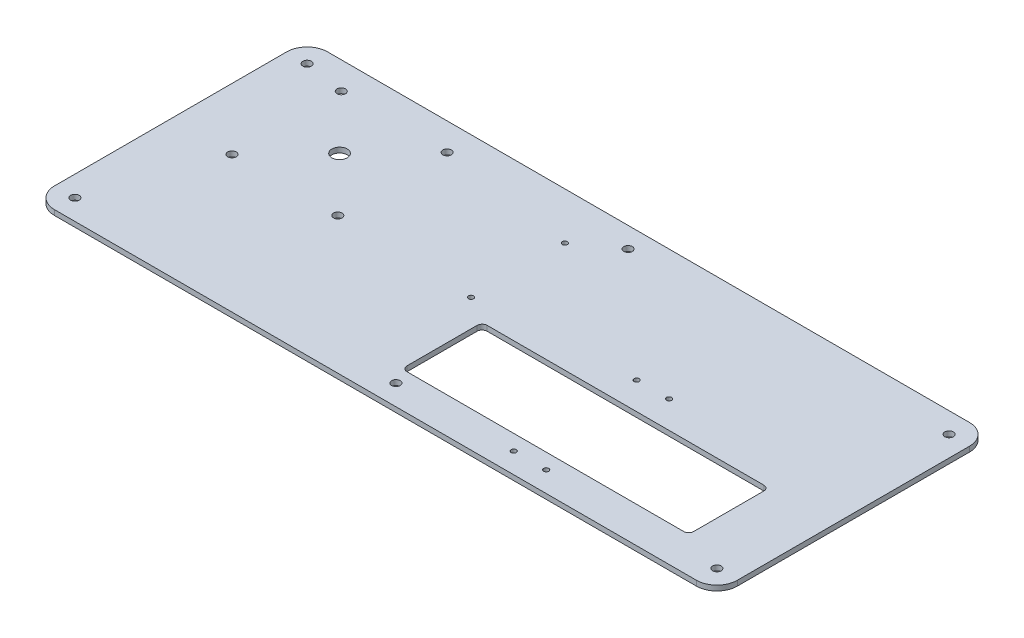
ISO-10303-21;
HEADER;
FILE_DESCRIPTION(('STEP AP214'),'2;1');
FILE_NAME('part.step','',(''),(''),'','','');
FILE_SCHEMA(('AUTOMOTIVE_DESIGN { 1 0 10303 214 1 1 1 1 }'));
ENDSEC;
DATA;
#1=APPLICATION_CONTEXT('core data for automotive mechanical design processes');
#2=APPLICATION_PROTOCOL_DEFINITION('international standard','automotive_design',2000,#1);
#3=PRODUCT_CONTEXT('',#1,'mechanical');
#4=PRODUCT('Part','Part','',(#3));
#5=PRODUCT_RELATED_PRODUCT_CATEGORY('part','',(#4));
#6=PRODUCT_DEFINITION_FORMATION('','',#4);
#7=PRODUCT_DEFINITION_CONTEXT('part definition',#1,'design');
#8=PRODUCT_DEFINITION('design','',#6,#7);
#9=PRODUCT_DEFINITION_SHAPE('','',#8);
#10=(LENGTH_UNIT() NAMED_UNIT(*) SI_UNIT(.MILLI.,.METRE.));
#11=(NAMED_UNIT(*) PLANE_ANGLE_UNIT() SI_UNIT($,.RADIAN.));
#12=(NAMED_UNIT(*) SI_UNIT($,.STERADIAN.) SOLID_ANGLE_UNIT());
#13=UNCERTAINTY_MEASURE_WITH_UNIT(LENGTH_MEASURE(1.E-05),#10,'distance_accuracy_value','');
#14=(GEOMETRIC_REPRESENTATION_CONTEXT(3) GLOBAL_UNCERTAINTY_ASSIGNED_CONTEXT((#13)) GLOBAL_UNIT_ASSIGNED_CONTEXT((#10,
#11,#12)) REPRESENTATION_CONTEXT('',''));
#15=CARTESIAN_POINT('',(0.,0.,0.));
#16=DIRECTION('',(0.,0.,1.));
#17=DIRECTION('',(1.,0.,0.));
#18=AXIS2_PLACEMENT_3D('',#15,#16,#17);
#19=CARTESIAN_POINT('',(188.,3.,-68.));
#20=DIRECTION('',(0.,-1.,0.));
#21=DIRECTION('',(0.,0.,-1.));
#22=AXIS2_PLACEMENT_3D('',#19,#20,#21);
#23=PLANE('',#22);
#24=CARTESIAN_POINT('',(188.,3.,-68.));
#25=DIRECTION('',(0.,1.,0.));
#26=DIRECTION('',(0.,0.,-1.));
#27=AXIS2_PLACEMENT_3D('',#24,#25,#26);
#28=CIRCLE('',#27,12.);
#29=CARTESIAN_POINT('',(200.,3.,-68.));
#30=VERTEX_POINT('',#29);
#31=CARTESIAN_POINT('',(188.,3.,-80.));
#32=VERTEX_POINT('',#31);
#33=EDGE_CURVE('E251',#30,#32,#28,.T.);
#34=ORIENTED_EDGE('',*,*,#33,.T.);
#35=DIRECTION('',(-1.,0.,0.));
#36=VECTOR('',#35,1.);
#37=CARTESIAN_POINT('',(-188.,3.,-80.));
#38=LINE('',#37,#36);
#39=CARTESIAN_POINT('',(-188.,3.,-80.));
#40=VERTEX_POINT('',#39);
#41=EDGE_CURVE('E255',#32,#40,#38,.T.);
#42=ORIENTED_EDGE('',*,*,#41,.T.);
#43=CARTESIAN_POINT('',(-188.,3.,-68.));
#44=DIRECTION('',(0.,1.,0.));
#45=DIRECTION('',(0.,0.,-1.));
#46=AXIS2_PLACEMENT_3D('',#43,#44,#45);
#47=CIRCLE('',#46,12.);
#48=CARTESIAN_POINT('',(-200.,3.,-68.));
#49=VERTEX_POINT('',#48);
#50=EDGE_CURVE('E259',#40,#49,#47,.T.);
#51=ORIENTED_EDGE('',*,*,#50,.T.);
#52=DIRECTION('',(0.,0.,1.));
#53=VECTOR('',#52,1.);
#54=CARTESIAN_POINT('',(-200.,3.,68.));
#55=LINE('',#54,#53);
#56=CARTESIAN_POINT('',(-200.,3.,68.));
#57=VERTEX_POINT('',#56);
#58=EDGE_CURVE('E262',#49,#57,#55,.T.);
#59=ORIENTED_EDGE('',*,*,#58,.T.);
#60=CARTESIAN_POINT('',(-188.,3.,68.));
#61=DIRECTION('',(0.,1.,0.));
#62=DIRECTION('',(0.,0.,-1.));
#63=AXIS2_PLACEMENT_3D('',#60,#61,#62);
#64=CIRCLE('',#63,12.);
#65=CARTESIAN_POINT('',(-188.,3.,80.));
#66=VERTEX_POINT('',#65);
#67=EDGE_CURVE('E265',#57,#66,#64,.T.);
#68=ORIENTED_EDGE('',*,*,#67,.T.);
#69=DIRECTION('',(1.,0.,0.));
#70=VECTOR('',#69,1.);
#71=CARTESIAN_POINT('',(-188.,3.,80.));
#72=LINE('',#71,#70);
#73=CARTESIAN_POINT('',(188.,3.,80.));
#74=VERTEX_POINT('',#73);
#75=EDGE_CURVE('E268',#66,#74,#72,.T.);
#76=ORIENTED_EDGE('',*,*,#75,.T.);
#77=CARTESIAN_POINT('',(188.,3.,68.));
#78=DIRECTION('',(0.,1.,0.));
#79=DIRECTION('',(0.,0.,1.));
#80=AXIS2_PLACEMENT_3D('',#77,#78,#79);
#81=CIRCLE('',#80,12.);
#82=CARTESIAN_POINT('',(200.,3.,68.));
#83=VERTEX_POINT('',#82);
#84=EDGE_CURVE('E271',#74,#83,#81,.T.);
#85=ORIENTED_EDGE('',*,*,#84,.T.);
#86=DIRECTION('',(0.,0.,-1.));
#87=VECTOR('',#86,1.);
#88=CARTESIAN_POINT('',(200.,3.,68.));
#89=LINE('',#88,#87);
#90=EDGE_CURVE('E274',#83,#30,#89,.T.);
#91=ORIENTED_EDGE('',*,*,#90,.T.);
#92=EDGE_LOOP('',(#34,#42,#51,#59,#68,#76,#85,#91));
#93=FACE_BOUND('',#92,.T.);
#94=CARTESIAN_POINT('',(-2.5,3.,56.));
#95=DIRECTION('',(0.,1.,0.));
#96=DIRECTION('',(0.,0.,-1.));
#97=AXIS2_PLACEMENT_3D('',#94,#95,#96);
#98=CIRCLE('',#97,3.);
#99=CARTESIAN_POINT('',(-5.50000000000001,3.,56.));
#100=VERTEX_POINT('',#99);
#101=CARTESIAN_POINT('',(-2.5,3.,59.));
#102=VERTEX_POINT('',#101);
#103=EDGE_CURVE('E159',#100,#102,#98,.T.);
#104=ORIENTED_EDGE('',*,*,#103,.F.);
#105=DIRECTION('',(0.,0.,1.));
#106=VECTOR('',#105,1.);
#107=CARTESIAN_POINT('',(-5.50000000000001,3.,56.));
#108=LINE('',#107,#106);
#109=CARTESIAN_POINT('',(-5.50000000000001,3.,15.));
#110=VERTEX_POINT('',#109);
#111=EDGE_CURVE('E202',#110,#100,#108,.T.);
#112=ORIENTED_EDGE('',*,*,#111,.F.);
#113=CARTESIAN_POINT('',(-2.5,3.,15.));
#114=DIRECTION('',(0.,1.,0.));
#115=DIRECTION('',(0.,0.,-1.));
#116=AXIS2_PLACEMENT_3D('',#113,#114,#115);
#117=CIRCLE('',#116,3.);
#118=CARTESIAN_POINT('',(-2.5,3.,12.));
#119=VERTEX_POINT('',#118);
#120=EDGE_CURVE('E199',#119,#110,#117,.T.);
#121=ORIENTED_EDGE('',*,*,#120,.F.);
#122=DIRECTION('',(-1.,0.,0.));
#123=VECTOR('',#122,1.);
#124=CARTESIAN_POINT('',(-2.5,3.,12.));
#125=LINE('',#124,#123);
#126=CARTESIAN_POINT('',(159.5,3.,12.));
#127=VERTEX_POINT('',#126);
#128=EDGE_CURVE('E196',#127,#119,#125,.T.);
#129=ORIENTED_EDGE('',*,*,#128,.F.);
#130=CARTESIAN_POINT('',(159.5,3.,15.));
#131=DIRECTION('',(0.,1.,0.));
#132=DIRECTION('',(0.,0.,-1.));
#133=AXIS2_PLACEMENT_3D('',#130,#131,#132);
#134=CIRCLE('',#133,3.);
#135=CARTESIAN_POINT('',(162.5,3.,15.));
#136=VERTEX_POINT('',#135);
#137=EDGE_CURVE('E193',#136,#127,#134,.T.);
#138=ORIENTED_EDGE('',*,*,#137,.F.);
#139=DIRECTION('',(0.,0.,-1.));
#140=VECTOR('',#139,1.);
#141=CARTESIAN_POINT('',(162.5,3.,56.));
#142=LINE('',#141,#140);
#143=CARTESIAN_POINT('',(162.5,3.,56.));
#144=VERTEX_POINT('',#143);
#145=EDGE_CURVE('E187',#144,#136,#142,.T.);
#146=ORIENTED_EDGE('',*,*,#145,.F.);
#147=CARTESIAN_POINT('',(159.5,3.,56.));
#148=DIRECTION('',(0.,1.,0.));
#149=DIRECTION('',(0.,0.,1.));
#150=AXIS2_PLACEMENT_3D('',#147,#148,#149);
#151=CIRCLE('',#150,3.);
#152=CARTESIAN_POINT('',(159.5,3.,59.));
#153=VERTEX_POINT('',#152);
#154=EDGE_CURVE('E183',#153,#144,#151,.T.);
#155=ORIENTED_EDGE('',*,*,#154,.F.);
#156=DIRECTION('',(1.,0.,0.));
#157=VECTOR('',#156,1.);
#158=CARTESIAN_POINT('',(-2.5,3.,59.));
#159=LINE('',#158,#157);
#160=EDGE_CURVE('E168',#102,#153,#159,.T.);
#161=ORIENTED_EDGE('',*,*,#160,.F.);
#162=EDGE_LOOP('',(#104,#112,#121,#129,#138,#146,#155,#161));
#163=FACE_BOUND('',#162,.T.);
#164=CARTESIAN_POINT('',(-188.,3.,-68.));
#165=DIRECTION('',(0.,1.,0.));
#166=DIRECTION('',(0.,0.,1.));
#167=AXIS2_PLACEMENT_3D('',#164,#165,#166);
#168=CIRCLE('',#167,2.5);
#169=CARTESIAN_POINT('',(-188.,3.,-65.5));
#170=VERTEX_POINT('',#169);
#171=EDGE_CURVE('E207',#170,#170,#168,.T.);
#172=ORIENTED_EDGE('',*,*,#171,.F.);
#173=EDGE_LOOP('',(#172));
#174=FACE_BOUND('',#173,.T.);
#175=CARTESIAN_POINT('',(0.,3.,-68.));
#176=DIRECTION('',(0.,1.,0.));
#177=DIRECTION('',(0.,0.,1.));
#178=AXIS2_PLACEMENT_3D('',#175,#176,#177);
#179=CIRCLE('',#178,2.5);
#180=CARTESIAN_POINT('',(0.,3.,-65.5));
#181=VERTEX_POINT('',#180);
#182=EDGE_CURVE('E612',#181,#181,#179,.T.);
#183=ORIENTED_EDGE('',*,*,#182,.F.);
#184=EDGE_LOOP('',(#183));
#185=FACE_BOUND('',#184,.T.);
#186=CARTESIAN_POINT('',(188.,3.,-68.));
#187=DIRECTION('',(0.,1.,0.));
#188=DIRECTION('',(0.,0.,1.));
#189=AXIS2_PLACEMENT_3D('',#186,#187,#188);
#190=CIRCLE('',#189,2.5);
#191=CARTESIAN_POINT('',(188.,3.,-65.5));
#192=VERTEX_POINT('',#191);
#193=EDGE_CURVE('E604',#192,#192,#190,.T.);
#194=ORIENTED_EDGE('',*,*,#193,.F.);
#195=EDGE_LOOP('',(#194));
#196=FACE_BOUND('',#195,.T.);
#197=CARTESIAN_POINT('',(188.,3.,68.));
#198=DIRECTION('',(0.,1.,0.));
#199=DIRECTION('',(0.,0.,1.));
#200=AXIS2_PLACEMENT_3D('',#197,#198,#199);
#201=CIRCLE('',#200,2.5);
#202=CARTESIAN_POINT('',(188.,3.,70.5));
#203=VERTEX_POINT('',#202);
#204=EDGE_CURVE('E596',#203,#203,#201,.T.);
#205=ORIENTED_EDGE('',*,*,#204,.F.);
#206=EDGE_LOOP('',(#205));
#207=FACE_BOUND('',#206,.T.);
#208=CARTESIAN_POINT('',(0.,3.,68.));
#209=DIRECTION('',(0.,1.,0.));
#210=DIRECTION('',(0.,0.,1.));
#211=AXIS2_PLACEMENT_3D('',#208,#209,#210);
#212=CIRCLE('',#211,2.5);
#213=CARTESIAN_POINT('',(0.,3.,70.5));
#214=VERTEX_POINT('',#213);
#215=EDGE_CURVE('E588',#214,#214,#212,.T.);
#216=ORIENTED_EDGE('',*,*,#215,.F.);
#217=EDGE_LOOP('',(#216));
#218=FACE_BOUND('',#217,.T.);
#219=CARTESIAN_POINT('',(-188.,3.,68.));
#220=DIRECTION('',(0.,1.,0.));
#221=DIRECTION('',(0.,0.,1.));
#222=AXIS2_PLACEMENT_3D('',#219,#220,#221);
#223=CIRCLE('',#222,2.5);
#224=CARTESIAN_POINT('',(-188.,3.,70.5));
#225=VERTEX_POINT('',#224);
#226=EDGE_CURVE('E580',#225,#225,#223,.T.);
#227=ORIENTED_EDGE('',*,*,#226,.F.);
#228=EDGE_LOOP('',(#227));
#229=FACE_BOUND('',#228,.T.);
#230=CARTESIAN_POINT('',(-21.5,3.,-52.5));
#231=DIRECTION('',(0.,1.,0.));
#232=DIRECTION('',(0.,0.,1.));
#233=AXIS2_PLACEMENT_3D('',#230,#231,#232);
#234=CIRCLE('',#233,1.5);
#235=CARTESIAN_POINT('',(-21.5,3.,-51.));
#236=VERTEX_POINT('',#235);
#237=EDGE_CURVE('E572',#236,#236,#234,.T.);
#238=ORIENTED_EDGE('',*,*,#237,.F.);
#239=EDGE_LOOP('',(#238));
#240=FACE_BOUND('',#239,.T.);
#241=CARTESIAN_POINT('',(-21.5,3.,2.49999999999998));
#242=DIRECTION('',(0.,1.,0.));
#243=DIRECTION('',(0.,0.,1.));
#244=AXIS2_PLACEMENT_3D('',#241,#242,#243);
#245=CIRCLE('',#244,1.5);
#246=CARTESIAN_POINT('',(-21.5,3.,3.99999999999998));
#247=VERTEX_POINT('',#246);
#248=EDGE_CURVE('E564',#247,#247,#245,.T.);
#249=ORIENTED_EDGE('',*,*,#248,.F.);
#250=EDGE_LOOP('',(#249));
#251=FACE_BOUND('',#250,.T.);
#252=CARTESIAN_POINT('',(69.,3.,-3.99999999999999));
#253=DIRECTION('',(0.,1.,0.));
#254=DIRECTION('',(0.,0.,1.));
#255=AXIS2_PLACEMENT_3D('',#252,#253,#254);
#256=CIRCLE('',#255,1.5);
#257=CARTESIAN_POINT('',(69.,3.,-2.49999999999999));
#258=VERTEX_POINT('',#257);
#259=EDGE_CURVE('E556',#258,#258,#256,.T.);
#260=ORIENTED_EDGE('',*,*,#259,.F.);
#261=EDGE_LOOP('',(#260));
#262=FACE_BOUND('',#261,.T.);
#263=CARTESIAN_POINT('',(88.,3.,-3.99999999999999));
#264=DIRECTION('',(0.,1.,0.));
#265=DIRECTION('',(0.,0.,1.));
#266=AXIS2_PLACEMENT_3D('',#263,#264,#265);
#267=CIRCLE('',#266,1.5);
#268=CARTESIAN_POINT('',(88.,3.,-2.49999999999999));
#269=VERTEX_POINT('',#268);
#270=EDGE_CURVE('E548',#269,#269,#267,.T.);
#271=ORIENTED_EDGE('',*,*,#270,.F.);
#272=EDGE_LOOP('',(#271));
#273=FACE_BOUND('',#272,.T.);
#274=CARTESIAN_POINT('',(69.,3.,68.));
#275=DIRECTION('',(0.,1.,0.));
#276=DIRECTION('',(0.,0.,1.));
#277=AXIS2_PLACEMENT_3D('',#274,#275,#276);
#278=CIRCLE('',#277,1.5);
#279=CARTESIAN_POINT('',(69.,3.,69.5));
#280=VERTEX_POINT('',#279);
#281=EDGE_CURVE('E540',#280,#280,#278,.T.);
#282=ORIENTED_EDGE('',*,*,#281,.F.);
#283=EDGE_LOOP('',(#282));
#284=FACE_BOUND('',#283,.T.);
#285=CARTESIAN_POINT('',(88.,3.,68.));
#286=DIRECTION('',(0.,1.,0.));
#287=DIRECTION('',(0.,0.,1.));
#288=AXIS2_PLACEMENT_3D('',#285,#286,#287);
#289=CIRCLE('',#288,1.5);
#290=CARTESIAN_POINT('',(88.,3.,69.5));
#291=VERTEX_POINT('',#290);
#292=EDGE_CURVE('E532',#291,#291,#289,.T.);
#293=ORIENTED_EDGE('',*,*,#292,.F.);
#294=EDGE_LOOP('',(#293));
#295=FACE_BOUND('',#294,.T.);
#296=CARTESIAN_POINT('',(-133.,3.,-32.));
#297=DIRECTION('',(0.,1.,0.));
#298=DIRECTION('',(0.,0.,1.));
#299=AXIS2_PLACEMENT_3D('',#296,#297,#298);
#300=CIRCLE('',#299,4.49999999999999);
#301=CARTESIAN_POINT('',(-133.,3.,-27.5));
#302=VERTEX_POINT('',#301);
#303=EDGE_CURVE('E524',#302,#302,#300,.T.);
#304=ORIENTED_EDGE('',*,*,#303,.F.);
#305=EDGE_LOOP('',(#304));
#306=FACE_BOUND('',#305,.T.);
#307=CARTESIAN_POINT('',(-164.,3.,-64.));
#308=DIRECTION('',(0.,1.,0.));
#309=DIRECTION('',(0.,0.,1.));
#310=AXIS2_PLACEMENT_3D('',#307,#308,#309);
#311=CIRCLE('',#310,2.5);
#312=CARTESIAN_POINT('',(-164.,3.,-61.5));
#313=VERTEX_POINT('',#312);
#314=EDGE_CURVE('E516',#313,#313,#311,.T.);
#315=ORIENTED_EDGE('',*,*,#314,.F.);
#316=EDGE_LOOP('',(#315));
#317=FACE_BOUND('',#316,.T.);
#318=CARTESIAN_POINT('',(-102.,3.,-64.));
#319=DIRECTION('',(0.,1.,0.));
#320=DIRECTION('',(0.,0.,1.));
#321=AXIS2_PLACEMENT_3D('',#318,#319,#320);
#322=CIRCLE('',#321,2.5);
#323=CARTESIAN_POINT('',(-102.,3.,-61.5));
#324=VERTEX_POINT('',#323);
#325=EDGE_CURVE('E508',#324,#324,#322,.T.);
#326=ORIENTED_EDGE('',*,*,#325,.F.);
#327=EDGE_LOOP('',(#326));
#328=FACE_BOUND('',#327,.T.);
#329=CARTESIAN_POINT('',(-102.,3.,0.));
#330=DIRECTION('',(0.,1.,0.));
#331=DIRECTION('',(0.,0.,1.));
#332=AXIS2_PLACEMENT_3D('',#329,#330,#331);
#333=CIRCLE('',#332,2.5);
#334=CARTESIAN_POINT('',(-102.,3.,2.5));
#335=VERTEX_POINT('',#334);
#336=EDGE_CURVE('E500',#335,#335,#333,.T.);
#337=ORIENTED_EDGE('',*,*,#336,.F.);
#338=EDGE_LOOP('',(#337));
#339=FACE_BOUND('',#338,.T.);
#340=CARTESIAN_POINT('',(-164.,3.,0.));
#341=DIRECTION('',(0.,1.,0.));
#342=DIRECTION('',(0.,0.,1.));
#343=AXIS2_PLACEMENT_3D('',#340,#341,#342);
#344=CIRCLE('',#343,2.5);
#345=CARTESIAN_POINT('',(-164.,3.,2.5));
#346=VERTEX_POINT('',#345);
#347=EDGE_CURVE('E489',#346,#346,#344,.T.);
#348=ORIENTED_EDGE('',*,*,#347,.F.);
#349=EDGE_LOOP('',(#348));
#350=FACE_BOUND('',#349,.T.);
#351=ADVANCED_FACE('F45',(#93,#163,#174,#185,#196,#207,#218,#229,#240,#251,#262,#273,#284,#295,
#306,#317,#328,#339,#350),#23,.F.);
#352=CARTESIAN_POINT('',(188.,0.,-68.));
#353=DIRECTION('',(0.,-1.,0.));
#354=DIRECTION('',(0.,0.,-1.));
#355=AXIS2_PLACEMENT_3D('',#352,#353,#354);
#356=PLANE('',#355);
#357=CARTESIAN_POINT('',(-102.,0.,0.));
#358=DIRECTION('',(0.,1.,0.));
#359=DIRECTION('',(0.,0.,1.));
#360=AXIS2_PLACEMENT_3D('',#357,#358,#359);
#361=CIRCLE('',#360,2.5);
#362=CARTESIAN_POINT('',(-102.,0.,2.5));
#363=VERTEX_POINT('',#362);
#364=EDGE_CURVE('E497',#363,#363,#361,.T.);
#365=ORIENTED_EDGE('',*,*,#364,.T.);
#366=EDGE_LOOP('',(#365));
#367=FACE_BOUND('',#366,.T.);
#368=CARTESIAN_POINT('',(-164.,0.,-64.));
#369=DIRECTION('',(0.,1.,0.));
#370=DIRECTION('',(0.,0.,1.));
#371=AXIS2_PLACEMENT_3D('',#368,#369,#370);
#372=CIRCLE('',#371,2.5);
#373=CARTESIAN_POINT('',(-164.,0.,-61.5));
#374=VERTEX_POINT('',#373);
#375=EDGE_CURVE('E512',#374,#374,#372,.T.);
#376=ORIENTED_EDGE('',*,*,#375,.T.);
#377=EDGE_LOOP('',(#376));
#378=FACE_BOUND('',#377,.T.);
#379=CARTESIAN_POINT('',(88.,0.,68.));
#380=DIRECTION('',(0.,1.,0.));
#381=DIRECTION('',(0.,0.,1.));
#382=AXIS2_PLACEMENT_3D('',#379,#380,#381);
#383=CIRCLE('',#382,1.5);
#384=CARTESIAN_POINT('',(88.,0.,69.5));
#385=VERTEX_POINT('',#384);
#386=EDGE_CURVE('E528',#385,#385,#383,.T.);
#387=ORIENTED_EDGE('',*,*,#386,.T.);
#388=EDGE_LOOP('',(#387));
#389=FACE_BOUND('',#388,.T.);
#390=CARTESIAN_POINT('',(88.,0.,-3.99999999999999));
#391=DIRECTION('',(0.,1.,0.));
#392=DIRECTION('',(0.,0.,1.));
#393=AXIS2_PLACEMENT_3D('',#390,#391,#392);
#394=CIRCLE('',#393,1.5);
#395=CARTESIAN_POINT('',(88.,0.,-2.49999999999999));
#396=VERTEX_POINT('',#395);
#397=EDGE_CURVE('E544',#396,#396,#394,.T.);
#398=ORIENTED_EDGE('',*,*,#397,.T.);
#399=EDGE_LOOP('',(#398));
#400=FACE_BOUND('',#399,.T.);
#401=CARTESIAN_POINT('',(-21.5,0.,2.49999999999998));
#402=DIRECTION('',(0.,1.,0.));
#403=DIRECTION('',(0.,0.,1.));
#404=AXIS2_PLACEMENT_3D('',#401,#402,#403);
#405=CIRCLE('',#404,1.5);
#406=CARTESIAN_POINT('',(-21.5,0.,3.99999999999998));
#407=VERTEX_POINT('',#406);
#408=EDGE_CURVE('E560',#407,#407,#405,.T.);
#409=ORIENTED_EDGE('',*,*,#408,.T.);
#410=EDGE_LOOP('',(#409));
#411=FACE_BOUND('',#410,.T.);
#412=CARTESIAN_POINT('',(-188.,0.,68.));
#413=DIRECTION('',(0.,1.,0.));
#414=DIRECTION('',(0.,0.,1.));
#415=AXIS2_PLACEMENT_3D('',#412,#413,#414);
#416=CIRCLE('',#415,2.5);
#417=CARTESIAN_POINT('',(-188.,0.,70.5));
#418=VERTEX_POINT('',#417);
#419=EDGE_CURVE('E576',#418,#418,#416,.T.);
#420=ORIENTED_EDGE('',*,*,#419,.T.);
#421=EDGE_LOOP('',(#420));
#422=FACE_BOUND('',#421,.T.);
#423=CARTESIAN_POINT('',(188.,0.,68.));
#424=DIRECTION('',(0.,1.,0.));
#425=DIRECTION('',(0.,0.,1.));
#426=AXIS2_PLACEMENT_3D('',#423,#424,#425);
#427=CIRCLE('',#426,2.5);
#428=CARTESIAN_POINT('',(188.,0.,70.5));
#429=VERTEX_POINT('',#428);
#430=EDGE_CURVE('E592',#429,#429,#427,.T.);
#431=ORIENTED_EDGE('',*,*,#430,.T.);
#432=EDGE_LOOP('',(#431));
#433=FACE_BOUND('',#432,.T.);
#434=CARTESIAN_POINT('',(0.,0.,-68.));
#435=DIRECTION('',(0.,1.,0.));
#436=DIRECTION('',(0.,0.,1.));
#437=AXIS2_PLACEMENT_3D('',#434,#435,#436);
#438=CIRCLE('',#437,2.5);
#439=CARTESIAN_POINT('',(0.,0.,-65.5));
#440=VERTEX_POINT('',#439);
#441=EDGE_CURVE('E608',#440,#440,#438,.T.);
#442=ORIENTED_EDGE('',*,*,#441,.T.);
#443=EDGE_LOOP('',(#442));
#444=FACE_BOUND('',#443,.T.);
#445=DIRECTION('',(0.,0.,1.));
#446=VECTOR('',#445,1.);
#447=CARTESIAN_POINT('',(-5.50000000000001,0.,56.));
#448=LINE('',#447,#446);
#449=CARTESIAN_POINT('',(-5.5,0.,15.));
#450=VERTEX_POINT('',#449);
#451=CARTESIAN_POINT('',(-5.50000000000001,0.,56.));
#452=VERTEX_POINT('',#451);
#453=EDGE_CURVE('E169',#450,#452,#448,.T.);
#454=ORIENTED_EDGE('',*,*,#453,.T.);
#455=CARTESIAN_POINT('',(-2.5,0.,56.));
#456=DIRECTION('',(0.,1.,0.));
#457=DIRECTION('',(0.,0.,-1.));
#458=AXIS2_PLACEMENT_3D('',#455,#456,#457);
#459=CIRCLE('',#458,3.);
#460=CARTESIAN_POINT('',(-2.5,0.,59.));
#461=VERTEX_POINT('',#460);
#462=EDGE_CURVE('E69',#452,#461,#459,.T.);
#463=ORIENTED_EDGE('',*,*,#462,.T.);
#464=DIRECTION('',(1.,0.,0.));
#465=VECTOR('',#464,1.);
#466=CARTESIAN_POINT('',(-2.5,0.,59.));
#467=LINE('',#466,#465);
#468=CARTESIAN_POINT('',(159.5,0.,59.));
#469=VERTEX_POINT('',#468);
#470=EDGE_CURVE('E175',#461,#469,#467,.T.);
#471=ORIENTED_EDGE('',*,*,#470,.T.);
#472=CARTESIAN_POINT('',(159.5,0.,56.));
#473=DIRECTION('',(0.,1.,0.));
#474=DIRECTION('',(0.,0.,1.));
#475=AXIS2_PLACEMENT_3D('',#472,#473,#474);
#476=CIRCLE('',#475,3.);
#477=CARTESIAN_POINT('',(162.5,0.,56.));
#478=VERTEX_POINT('',#477);
#479=EDGE_CURVE('E210',#469,#478,#476,.T.);
#480=ORIENTED_EDGE('',*,*,#479,.T.);
#481=DIRECTION('',(0.,0.,-1.));
#482=VECTOR('',#481,1.);
#483=CARTESIAN_POINT('',(162.5,0.,56.));
#484=LINE('',#483,#482);
#485=CARTESIAN_POINT('',(162.5,0.,15.));
#486=VERTEX_POINT('',#485);
#487=EDGE_CURVE('E214',#478,#486,#484,.T.);
#488=ORIENTED_EDGE('',*,*,#487,.T.);
#489=CARTESIAN_POINT('',(159.5,0.,15.));
#490=DIRECTION('',(0.,1.,0.));
#491=DIRECTION('',(0.,0.,-1.));
#492=AXIS2_PLACEMENT_3D('',#489,#490,#491);
#493=CIRCLE('',#492,3.);
#494=CARTESIAN_POINT('',(159.5,0.,12.));
#495=VERTEX_POINT('',#494);
#496=EDGE_CURVE('E218',#486,#495,#493,.T.);
#497=ORIENTED_EDGE('',*,*,#496,.T.);
#498=DIRECTION('',(-1.,0.,0.));
#499=VECTOR('',#498,1.);
#500=CARTESIAN_POINT('',(-2.5,0.,12.));
#501=LINE('',#500,#499);
#502=CARTESIAN_POINT('',(-2.5,0.,12.));
#503=VERTEX_POINT('',#502);
#504=EDGE_CURVE('E222',#495,#503,#501,.T.);
#505=ORIENTED_EDGE('',*,*,#504,.T.);
#506=CARTESIAN_POINT('',(-2.5,0.,15.));
#507=DIRECTION('',(0.,1.,0.));
#508=DIRECTION('',(0.,0.,-1.));
#509=AXIS2_PLACEMENT_3D('',#506,#507,#508);
#510=CIRCLE('',#509,3.);
#511=EDGE_CURVE('E226',#503,#450,#510,.T.);
#512=ORIENTED_EDGE('',*,*,#511,.T.);
#513=EDGE_LOOP('',(#454,#463,#471,#480,#488,#497,#505,#512));
#514=FACE_BOUND('',#513,.T.);
#515=CARTESIAN_POINT('',(188.,0.,-68.));
#516=DIRECTION('',(0.,1.,0.));
#517=DIRECTION('',(0.,0.,-1.));
#518=AXIS2_PLACEMENT_3D('',#515,#516,#517);
#519=CIRCLE('',#518,12.);
#520=CARTESIAN_POINT('',(200.,0.,-68.));
#521=VERTEX_POINT('',#520);
#522=CARTESIAN_POINT('',(188.,0.,-80.));
#523=VERTEX_POINT('',#522);
#524=EDGE_CURVE('E177',#521,#523,#519,.T.);
#525=ORIENTED_EDGE('',*,*,#524,.F.);
#526=DIRECTION('',(0.,0.,-1.));
#527=VECTOR('',#526,1.);
#528=CARTESIAN_POINT('',(200.,0.,68.));
#529=LINE('',#528,#527);
#530=CARTESIAN_POINT('',(200.,0.,68.));
#531=VERTEX_POINT('',#530);
#532=EDGE_CURVE('E256',#531,#521,#529,.T.);
#533=ORIENTED_EDGE('',*,*,#532,.F.);
#534=CARTESIAN_POINT('',(188.,0.,68.));
#535=DIRECTION('',(0.,1.,0.));
#536=DIRECTION('',(0.,0.,1.));
#537=AXIS2_PLACEMENT_3D('',#534,#535,#536);
#538=CIRCLE('',#537,12.);
#539=CARTESIAN_POINT('',(188.,0.,80.));
#540=VERTEX_POINT('',#539);
#541=EDGE_CURVE('E296',#540,#531,#538,.T.);
#542=ORIENTED_EDGE('',*,*,#541,.F.);
#543=DIRECTION('',(1.,0.,0.));
#544=VECTOR('',#543,1.);
#545=CARTESIAN_POINT('',(-188.,0.,80.));
#546=LINE('',#545,#544);
#547=CARTESIAN_POINT('',(-188.,0.,80.));
#548=VERTEX_POINT('',#547);
#549=EDGE_CURVE('E293',#548,#540,#546,.T.);
#550=ORIENTED_EDGE('',*,*,#549,.F.);
#551=CARTESIAN_POINT('',(-188.,0.,68.));
#552=DIRECTION('',(0.,1.,0.));
#553=DIRECTION('',(0.,0.,-1.));
#554=AXIS2_PLACEMENT_3D('',#551,#552,#553);
#555=CIRCLE('',#554,12.);
#556=CARTESIAN_POINT('',(-200.,0.,68.));
#557=VERTEX_POINT('',#556);
#558=EDGE_CURVE('E290',#557,#548,#555,.T.);
#559=ORIENTED_EDGE('',*,*,#558,.F.);
#560=DIRECTION('',(0.,0.,1.));
#561=VECTOR('',#560,1.);
#562=CARTESIAN_POINT('',(-200.,0.,68.));
#563=LINE('',#562,#561);
#564=CARTESIAN_POINT('',(-200.,0.,-68.));
#565=VERTEX_POINT('',#564);
#566=EDGE_CURVE('E287',#565,#557,#563,.T.);
#567=ORIENTED_EDGE('',*,*,#566,.F.);
#568=CARTESIAN_POINT('',(-188.,0.,-68.));
#569=DIRECTION('',(0.,1.,0.));
#570=DIRECTION('',(0.,0.,-1.));
#571=AXIS2_PLACEMENT_3D('',#568,#569,#570);
#572=CIRCLE('',#571,12.);
#573=CARTESIAN_POINT('',(-188.,0.,-80.));
#574=VERTEX_POINT('',#573);
#575=EDGE_CURVE('E284',#574,#565,#572,.T.);
#576=ORIENTED_EDGE('',*,*,#575,.F.);
#577=DIRECTION('',(-1.,0.,0.));
#578=VECTOR('',#577,1.);
#579=CARTESIAN_POINT('',(-188.,0.,-80.));
#580=LINE('',#579,#578);
#581=EDGE_CURVE('E281',#523,#574,#580,.T.);
#582=ORIENTED_EDGE('',*,*,#581,.F.);
#583=EDGE_LOOP('',(#525,#533,#542,#550,#559,#567,#576,#582));
#584=FACE_BOUND('',#583,.T.);
#585=CARTESIAN_POINT('',(-188.,0.,-68.));
#586=DIRECTION('',(0.,1.,0.));
#587=DIRECTION('',(0.,0.,1.));
#588=AXIS2_PLACEMENT_3D('',#585,#586,#587);
#589=CIRCLE('',#588,2.5);
#590=CARTESIAN_POINT('',(-188.,0.,-65.5));
#591=VERTEX_POINT('',#590);
#592=EDGE_CURVE('E616',#591,#591,#589,.T.);
#593=ORIENTED_EDGE('',*,*,#592,.T.);
#594=EDGE_LOOP('',(#593));
#595=FACE_BOUND('',#594,.T.);
#596=CARTESIAN_POINT('',(188.,0.,-68.));
#597=DIRECTION('',(0.,1.,0.));
#598=DIRECTION('',(0.,0.,1.));
#599=AXIS2_PLACEMENT_3D('',#596,#597,#598);
#600=CIRCLE('',#599,2.5);
#601=CARTESIAN_POINT('',(188.,0.,-65.5));
#602=VERTEX_POINT('',#601);
#603=EDGE_CURVE('E600',#602,#602,#600,.T.);
#604=ORIENTED_EDGE('',*,*,#603,.T.);
#605=EDGE_LOOP('',(#604));
#606=FACE_BOUND('',#605,.T.);
#607=CARTESIAN_POINT('',(0.,0.,68.));
#608=DIRECTION('',(0.,1.,0.));
#609=DIRECTION('',(0.,0.,1.));
#610=AXIS2_PLACEMENT_3D('',#607,#608,#609);
#611=CIRCLE('',#610,2.5);
#612=CARTESIAN_POINT('',(0.,0.,70.5));
#613=VERTEX_POINT('',#612);
#614=EDGE_CURVE('E584',#613,#613,#611,.T.);
#615=ORIENTED_EDGE('',*,*,#614,.T.);
#616=EDGE_LOOP('',(#615));
#617=FACE_BOUND('',#616,.T.);
#618=CARTESIAN_POINT('',(-21.5,0.,-52.5));
#619=DIRECTION('',(0.,1.,0.));
#620=DIRECTION('',(0.,0.,1.));
#621=AXIS2_PLACEMENT_3D('',#618,#619,#620);
#622=CIRCLE('',#621,1.5);
#623=CARTESIAN_POINT('',(-21.5,0.,-51.));
#624=VERTEX_POINT('',#623);
#625=EDGE_CURVE('E568',#624,#624,#622,.T.);
#626=ORIENTED_EDGE('',*,*,#625,.T.);
#627=EDGE_LOOP('',(#626));
#628=FACE_BOUND('',#627,.T.);
#629=CARTESIAN_POINT('',(69.,0.,-3.99999999999999));
#630=DIRECTION('',(0.,1.,0.));
#631=DIRECTION('',(0.,0.,1.));
#632=AXIS2_PLACEMENT_3D('',#629,#630,#631);
#633=CIRCLE('',#632,1.5);
#634=CARTESIAN_POINT('',(69.,0.,-2.49999999999999));
#635=VERTEX_POINT('',#634);
#636=EDGE_CURVE('E552',#635,#635,#633,.T.);
#637=ORIENTED_EDGE('',*,*,#636,.T.);
#638=EDGE_LOOP('',(#637));
#639=FACE_BOUND('',#638,.T.);
#640=CARTESIAN_POINT('',(69.,0.,68.));
#641=DIRECTION('',(0.,1.,0.));
#642=DIRECTION('',(0.,0.,1.));
#643=AXIS2_PLACEMENT_3D('',#640,#641,#642);
#644=CIRCLE('',#643,1.5);
#645=CARTESIAN_POINT('',(69.,0.,69.5));
#646=VERTEX_POINT('',#645);
#647=EDGE_CURVE('E536',#646,#646,#644,.T.);
#648=ORIENTED_EDGE('',*,*,#647,.T.);
#649=EDGE_LOOP('',(#648));
#650=FACE_BOUND('',#649,.T.);
#651=CARTESIAN_POINT('',(-133.,0.,-32.));
#652=DIRECTION('',(0.,1.,0.));
#653=DIRECTION('',(0.,0.,1.));
#654=AXIS2_PLACEMENT_3D('',#651,#652,#653);
#655=CIRCLE('',#654,4.49999999999999);
#656=CARTESIAN_POINT('',(-133.,0.,-27.5));
#657=VERTEX_POINT('',#656);
#658=EDGE_CURVE('E520',#657,#657,#655,.T.);
#659=ORIENTED_EDGE('',*,*,#658,.T.);
#660=EDGE_LOOP('',(#659));
#661=FACE_BOUND('',#660,.T.);
#662=CARTESIAN_POINT('',(-102.,0.,-64.));
#663=DIRECTION('',(0.,1.,0.));
#664=DIRECTION('',(0.,0.,1.));
#665=AXIS2_PLACEMENT_3D('',#662,#663,#664);
#666=CIRCLE('',#665,2.5);
#667=CARTESIAN_POINT('',(-102.,0.,-61.5));
#668=VERTEX_POINT('',#667);
#669=EDGE_CURVE('E504',#668,#668,#666,.T.);
#670=ORIENTED_EDGE('',*,*,#669,.T.);
#671=EDGE_LOOP('',(#670));
#672=FACE_BOUND('',#671,.T.);
#673=CARTESIAN_POINT('',(-164.,0.,0.));
#674=DIRECTION('',(0.,1.,0.));
#675=DIRECTION('',(0.,0.,1.));
#676=AXIS2_PLACEMENT_3D('',#673,#674,#675);
#677=CIRCLE('',#676,2.5);
#678=CARTESIAN_POINT('',(-164.,0.,2.5));
#679=VERTEX_POINT('',#678);
#680=EDGE_CURVE('E492',#679,#679,#677,.T.);
#681=ORIENTED_EDGE('',*,*,#680,.T.);
#682=EDGE_LOOP('',(#681));
#683=FACE_BOUND('',#682,.T.);
#684=ADVANCED_FACE('F335',(#367,#378,#389,#400,#411,#422,#433,#444,#514,#584,#595,#606,#617,
#628,#639,#650,#661,#672,#683),#356,.T.);
#685=CARTESIAN_POINT('',(188.,3.,-68.));
#686=DIRECTION('',(0.,-1.,0.));
#687=DIRECTION('',(0.,0.,-1.));
#688=AXIS2_PLACEMENT_3D('',#685,#686,#687);
#689=CYLINDRICAL_SURFACE('',#688,12.);
#690=ORIENTED_EDGE('',*,*,#524,.T.);
#691=DIRECTION('',(0.,-1.,0.));
#692=VECTOR('',#691,1.);
#693=CARTESIAN_POINT('',(188.,3.,-80.));
#694=LINE('',#693,#692);
#695=EDGE_CURVE('E11',#32,#523,#694,.T.);
#696=ORIENTED_EDGE('',*,*,#695,.F.);
#697=ORIENTED_EDGE('',*,*,#33,.F.);
#698=DIRECTION('',(0.,-1.,0.));
#699=VECTOR('',#698,1.);
#700=CARTESIAN_POINT('',(200.,3.,-68.));
#701=LINE('',#700,#699);
#702=EDGE_CURVE('E277',#30,#521,#701,.T.);
#703=ORIENTED_EDGE('',*,*,#702,.T.);
#704=EDGE_LOOP('',(#690,#696,#697,#703));
#705=FACE_BOUND('',#704,.T.);
#706=ADVANCED_FACE('F47',(#705),#689,.T.);
#707=CARTESIAN_POINT('',(-188.,3.,-80.));
#708=DIRECTION('',(0.,0.,1.));
#709=DIRECTION('',(1.,0.,0.));
#710=AXIS2_PLACEMENT_3D('',#707,#708,#709);
#711=PLANE('',#710);
#712=ORIENTED_EDGE('',*,*,#581,.T.);
#713=DIRECTION('',(0.,-1.,0.));
#714=VECTOR('',#713,1.);
#715=CARTESIAN_POINT('',(-188.,3.,-80.));
#716=LINE('',#715,#714);
#717=EDGE_CURVE('E54',#40,#574,#716,.T.);
#718=ORIENTED_EDGE('',*,*,#717,.F.);
#719=ORIENTED_EDGE('',*,*,#41,.F.);
#720=ORIENTED_EDGE('',*,*,#695,.T.);
#721=EDGE_LOOP('',(#712,#718,#719,#720));
#722=FACE_BOUND('',#721,.T.);
#723=ADVANCED_FACE('F352',(#722),#711,.F.);
#724=CARTESIAN_POINT('',(-188.,3.,-68.));
#725=DIRECTION('',(0.,-1.,0.));
#726=DIRECTION('',(0.,0.,-1.));
#727=AXIS2_PLACEMENT_3D('',#724,#725,#726);
#728=CYLINDRICAL_SURFACE('',#727,12.);
#729=ORIENTED_EDGE('',*,*,#575,.T.);
#730=DIRECTION('',(0.,-1.,0.));
#731=VECTOR('',#730,1.);
#732=CARTESIAN_POINT('',(-200.,3.,-68.));
#733=LINE('',#732,#731);
#734=EDGE_CURVE('E320',#49,#565,#733,.T.);
#735=ORIENTED_EDGE('',*,*,#734,.F.);
#736=ORIENTED_EDGE('',*,*,#50,.F.);
#737=ORIENTED_EDGE('',*,*,#717,.T.);
#738=EDGE_LOOP('',(#729,#735,#736,#737));
#739=FACE_BOUND('',#738,.T.);
#740=ADVANCED_FACE('F329',(#739),#728,.T.);
#741=CARTESIAN_POINT('',(-200.,3.,68.));
#742=DIRECTION('',(1.,0.,0.));
#743=DIRECTION('',(0.,0.,-1.));
#744=AXIS2_PLACEMENT_3D('',#741,#742,#743);
#745=PLANE('',#744);
#746=ORIENTED_EDGE('',*,*,#566,.T.);
#747=DIRECTION('',(0.,-1.,0.));
#748=VECTOR('',#747,1.);
#749=CARTESIAN_POINT('',(-200.,3.,68.));
#750=LINE('',#749,#748);
#751=EDGE_CURVE('E316',#57,#557,#750,.T.);
#752=ORIENTED_EDGE('',*,*,#751,.F.);
#753=ORIENTED_EDGE('',*,*,#58,.F.);
#754=ORIENTED_EDGE('',*,*,#734,.T.);
#755=EDGE_LOOP('',(#746,#752,#753,#754));
#756=FACE_BOUND('',#755,.T.);
#757=ADVANCED_FACE('F341',(#756),#745,.F.);
#758=CARTESIAN_POINT('',(-188.,3.,68.));
#759=DIRECTION('',(0.,-1.,0.));
#760=DIRECTION('',(0.,0.,-1.));
#761=AXIS2_PLACEMENT_3D('',#758,#759,#760);
#762=CYLINDRICAL_SURFACE('',#761,12.);
#763=ORIENTED_EDGE('',*,*,#558,.T.);
#764=DIRECTION('',(0.,-1.,0.));
#765=VECTOR('',#764,1.);
#766=CARTESIAN_POINT('',(-188.,3.,80.));
#767=LINE('',#766,#765);
#768=EDGE_CURVE('E312',#66,#548,#767,.T.);
#769=ORIENTED_EDGE('',*,*,#768,.F.);
#770=ORIENTED_EDGE('',*,*,#67,.F.);
#771=ORIENTED_EDGE('',*,*,#751,.T.);
#772=EDGE_LOOP('',(#763,#769,#770,#771));
#773=FACE_BOUND('',#772,.T.);
#774=ADVANCED_FACE('F345',(#773),#762,.T.);
#775=CARTESIAN_POINT('',(-188.,3.,80.));
#776=DIRECTION('',(0.,0.,-1.));
#777=DIRECTION('',(-1.,0.,0.));
#778=AXIS2_PLACEMENT_3D('',#775,#776,#777);
#779=PLANE('',#778);
#780=ORIENTED_EDGE('',*,*,#549,.T.);
#781=DIRECTION('',(0.,-1.,0.));
#782=VECTOR('',#781,1.);
#783=CARTESIAN_POINT('',(188.,3.,80.));
#784=LINE('',#783,#782);
#785=EDGE_CURVE('E308',#74,#540,#784,.T.);
#786=ORIENTED_EDGE('',*,*,#785,.F.);
#787=ORIENTED_EDGE('',*,*,#75,.F.);
#788=ORIENTED_EDGE('',*,*,#768,.T.);
#789=EDGE_LOOP('',(#780,#786,#787,#788));
#790=FACE_BOUND('',#789,.T.);
#791=ADVANCED_FACE('F365',(#790),#779,.F.);
#792=CARTESIAN_POINT('',(188.,3.,68.));
#793=DIRECTION('',(0.,-1.,0.));
#794=DIRECTION('',(0.,0.,-1.));
#795=AXIS2_PLACEMENT_3D('',#792,#793,#794);
#796=CYLINDRICAL_SURFACE('',#795,12.);
#797=ORIENTED_EDGE('',*,*,#541,.T.);
#798=DIRECTION('',(0.,-1.,0.));
#799=VECTOR('',#798,1.);
#800=CARTESIAN_POINT('',(200.,3.,68.));
#801=LINE('',#800,#799);
#802=EDGE_CURVE('E304',#83,#531,#801,.T.);
#803=ORIENTED_EDGE('',*,*,#802,.F.);
#804=ORIENTED_EDGE('',*,*,#84,.F.);
#805=ORIENTED_EDGE('',*,*,#785,.T.);
#806=EDGE_LOOP('',(#797,#803,#804,#805));
#807=FACE_BOUND('',#806,.T.);
#808=ADVANCED_FACE('F363',(#807),#796,.T.);
#809=CARTESIAN_POINT('',(200.,3.,68.));
#810=DIRECTION('',(-1.,0.,0.));
#811=DIRECTION('',(0.,0.,1.));
#812=AXIS2_PLACEMENT_3D('',#809,#810,#811);
#813=PLANE('',#812);
#814=ORIENTED_EDGE('',*,*,#532,.T.);
#815=ORIENTED_EDGE('',*,*,#702,.F.);
#816=ORIENTED_EDGE('',*,*,#90,.F.);
#817=ORIENTED_EDGE('',*,*,#802,.T.);
#818=EDGE_LOOP('',(#814,#815,#816,#817));
#819=FACE_BOUND('',#818,.T.);
#820=ADVANCED_FACE('F358',(#819),#813,.F.);
#821=CARTESIAN_POINT('',(-2.5,3.,56.));
#822=DIRECTION('',(0.,-1.,0.));
#823=DIRECTION('',(0.,0.,-1.));
#824=AXIS2_PLACEMENT_3D('',#821,#822,#823);
#825=CYLINDRICAL_SURFACE('',#824,3.);
#826=ORIENTED_EDGE('',*,*,#462,.F.);
#827=DIRECTION('',(0.,-1.,0.));
#828=VECTOR('',#827,1.);
#829=CARTESIAN_POINT('',(-5.50000000000001,3.,56.));
#830=LINE('',#829,#828);
#831=EDGE_CURVE('E163',#100,#452,#830,.T.);
#832=ORIENTED_EDGE('',*,*,#831,.F.);
#833=ORIENTED_EDGE('',*,*,#103,.T.);
#834=DIRECTION('',(0.,-1.,0.));
#835=VECTOR('',#834,1.);
#836=CARTESIAN_POINT('',(-2.5,3.,59.));
#837=LINE('',#836,#835);
#838=EDGE_CURVE('E162',#102,#461,#837,.T.);
#839=ORIENTED_EDGE('',*,*,#838,.T.);
#840=EDGE_LOOP('',(#826,#832,#833,#839));
#841=FACE_BOUND('',#840,.T.);
#842=ADVANCED_FACE('F161',(#841),#825,.F.);
#843=CARTESIAN_POINT('',(-2.5,3.,59.));
#844=DIRECTION('',(0.,0.,-1.));
#845=DIRECTION('',(-1.,0.,0.));
#846=AXIS2_PLACEMENT_3D('',#843,#844,#845);
#847=PLANE('',#846);
#848=ORIENTED_EDGE('',*,*,#470,.F.);
#849=ORIENTED_EDGE('',*,*,#838,.F.);
#850=ORIENTED_EDGE('',*,*,#160,.T.);
#851=DIRECTION('',(0.,-1.,0.));
#852=VECTOR('',#851,1.);
#853=CARTESIAN_POINT('',(159.5,3.,59.));
#854=LINE('',#853,#852);
#855=EDGE_CURVE('E178',#153,#469,#854,.T.);
#856=ORIENTED_EDGE('',*,*,#855,.T.);
#857=EDGE_LOOP('',(#848,#849,#850,#856));
#858=FACE_BOUND('',#857,.T.);
#859=ADVANCED_FACE('F172',(#858),#847,.T.);
#860=CARTESIAN_POINT('',(159.5,3.,56.));
#861=DIRECTION('',(0.,-1.,0.));
#862=DIRECTION('',(0.,0.,-1.));
#863=AXIS2_PLACEMENT_3D('',#860,#861,#862);
#864=CYLINDRICAL_SURFACE('',#863,3.);
#865=ORIENTED_EDGE('',*,*,#479,.F.);
#866=ORIENTED_EDGE('',*,*,#855,.F.);
#867=ORIENTED_EDGE('',*,*,#154,.T.);
#868=DIRECTION('',(0.,-1.,0.));
#869=VECTOR('',#868,1.);
#870=CARTESIAN_POINT('',(162.5,3.,56.));
#871=LINE('',#870,#869);
#872=EDGE_CURVE('E246',#144,#478,#871,.T.);
#873=ORIENTED_EDGE('',*,*,#872,.T.);
#874=EDGE_LOOP('',(#865,#866,#867,#873));
#875=FACE_BOUND('',#874,.T.);
#876=ADVANCED_FACE('F391',(#875),#864,.F.);
#877=CARTESIAN_POINT('',(162.5,3.,56.));
#878=DIRECTION('',(-1.,0.,0.));
#879=DIRECTION('',(0.,0.,1.));
#880=AXIS2_PLACEMENT_3D('',#877,#878,#879);
#881=PLANE('',#880);
#882=ORIENTED_EDGE('',*,*,#487,.F.);
#883=ORIENTED_EDGE('',*,*,#872,.F.);
#884=ORIENTED_EDGE('',*,*,#145,.T.);
#885=DIRECTION('',(0.,-1.,0.));
#886=VECTOR('',#885,1.);
#887=CARTESIAN_POINT('',(162.5,3.,15.));
#888=LINE('',#887,#886);
#889=EDGE_CURVE('E243',#136,#486,#888,.T.);
#890=ORIENTED_EDGE('',*,*,#889,.T.);
#891=EDGE_LOOP('',(#882,#883,#884,#890));
#892=FACE_BOUND('',#891,.T.);
#893=ADVANCED_FACE('F395',(#892),#881,.T.);
#894=CARTESIAN_POINT('',(159.5,3.,15.));
#895=DIRECTION('',(0.,-1.,0.));
#896=DIRECTION('',(0.,0.,-1.));
#897=AXIS2_PLACEMENT_3D('',#894,#895,#896);
#898=CYLINDRICAL_SURFACE('',#897,3.);
#899=ORIENTED_EDGE('',*,*,#496,.F.);
#900=ORIENTED_EDGE('',*,*,#889,.F.);
#901=ORIENTED_EDGE('',*,*,#137,.T.);
#902=DIRECTION('',(0.,-1.,0.));
#903=VECTOR('',#902,1.);
#904=CARTESIAN_POINT('',(159.5,3.,12.));
#905=LINE('',#904,#903);
#906=EDGE_CURVE('E240',#127,#495,#905,.T.);
#907=ORIENTED_EDGE('',*,*,#906,.T.);
#908=EDGE_LOOP('',(#899,#900,#901,#907));
#909=FACE_BOUND('',#908,.T.);
#910=ADVANCED_FACE('F401',(#909),#898,.F.);
#911=CARTESIAN_POINT('',(-2.5,3.,12.));
#912=DIRECTION('',(0.,0.,1.));
#913=DIRECTION('',(1.,0.,0.));
#914=AXIS2_PLACEMENT_3D('',#911,#912,#913);
#915=PLANE('',#914);
#916=ORIENTED_EDGE('',*,*,#504,.F.);
#917=ORIENTED_EDGE('',*,*,#906,.F.);
#918=ORIENTED_EDGE('',*,*,#128,.T.);
#919=DIRECTION('',(0.,-1.,0.));
#920=VECTOR('',#919,1.);
#921=CARTESIAN_POINT('',(-2.5,3.,12.));
#922=LINE('',#921,#920);
#923=EDGE_CURVE('E237',#119,#503,#922,.T.);
#924=ORIENTED_EDGE('',*,*,#923,.T.);
#925=EDGE_LOOP('',(#916,#917,#918,#924));
#926=FACE_BOUND('',#925,.T.);
#927=ADVANCED_FACE('F405',(#926),#915,.T.);
#928=CARTESIAN_POINT('',(-2.5,3.,15.));
#929=DIRECTION('',(0.,-1.,0.));
#930=DIRECTION('',(0.,0.,-1.));
#931=AXIS2_PLACEMENT_3D('',#928,#929,#930);
#932=CYLINDRICAL_SURFACE('',#931,3.);
#933=ORIENTED_EDGE('',*,*,#511,.F.);
#934=ORIENTED_EDGE('',*,*,#923,.F.);
#935=ORIENTED_EDGE('',*,*,#120,.T.);
#936=DIRECTION('',(0.,-1.,0.));
#937=VECTOR('',#936,1.);
#938=CARTESIAN_POINT('',(-5.5,3.,15.));
#939=LINE('',#938,#937);
#940=EDGE_CURVE('E61',#110,#450,#939,.T.);
#941=ORIENTED_EDGE('',*,*,#940,.T.);
#942=EDGE_LOOP('',(#933,#934,#935,#941));
#943=FACE_BOUND('',#942,.T.);
#944=ADVANCED_FACE('F409',(#943),#932,.F.);
#945=CARTESIAN_POINT('',(-5.50000000000001,3.,56.));
#946=DIRECTION('',(1.,0.,0.));
#947=DIRECTION('',(0.,0.,-1.));
#948=AXIS2_PLACEMENT_3D('',#945,#946,#947);
#949=PLANE('',#948);
#950=ORIENTED_EDGE('',*,*,#453,.F.);
#951=ORIENTED_EDGE('',*,*,#940,.F.);
#952=ORIENTED_EDGE('',*,*,#111,.T.);
#953=ORIENTED_EDGE('',*,*,#831,.T.);
#954=EDGE_LOOP('',(#950,#951,#952,#953));
#955=FACE_BOUND('',#954,.T.);
#956=ADVANCED_FACE('F413',(#955),#949,.T.);
#957=CARTESIAN_POINT('',(-188.,3.,-68.));
#958=DIRECTION('',(0.,-1.,0.));
#959=DIRECTION('',(0.,0.,-1.));
#960=AXIS2_PLACEMENT_3D('',#957,#958,#959);
#961=CYLINDRICAL_SURFACE('',#960,2.5);
#962=ORIENTED_EDGE('',*,*,#171,.T.);
#963=EDGE_LOOP('',(#962));
#964=FACE_BOUND('',#963,.T.);
#965=ORIENTED_EDGE('',*,*,#592,.F.);
#966=EDGE_LOOP('',(#965));
#967=FACE_BOUND('',#966,.T.);
#968=ADVANCED_FACE('F417',(#964,#967),#961,.F.);
#969=CARTESIAN_POINT('',(0.,3.,-68.));
#970=DIRECTION('',(0.,-1.,0.));
#971=DIRECTION('',(0.,0.,-1.));
#972=AXIS2_PLACEMENT_3D('',#969,#970,#971);
#973=CYLINDRICAL_SURFACE('',#972,2.5);
#974=ORIENTED_EDGE('',*,*,#182,.T.);
#975=EDGE_LOOP('',(#974));
#976=FACE_BOUND('',#975,.T.);
#977=ORIENTED_EDGE('',*,*,#441,.F.);
#978=EDGE_LOOP('',(#977));
#979=FACE_BOUND('',#978,.T.);
#980=ADVANCED_FACE('F420',(#976,#979),#973,.F.);
#981=CARTESIAN_POINT('',(188.,3.,-68.));
#982=DIRECTION('',(0.,-1.,0.));
#983=DIRECTION('',(0.,0.,-1.));
#984=AXIS2_PLACEMENT_3D('',#981,#982,#983);
#985=CYLINDRICAL_SURFACE('',#984,2.5);
#986=ORIENTED_EDGE('',*,*,#193,.T.);
#987=EDGE_LOOP('',(#986));
#988=FACE_BOUND('',#987,.T.);
#989=ORIENTED_EDGE('',*,*,#603,.F.);
#990=EDGE_LOOP('',(#989));
#991=FACE_BOUND('',#990,.T.);
#992=ADVANCED_FACE('F424',(#988,#991),#985,.F.);
#993=CARTESIAN_POINT('',(188.,3.,68.));
#994=DIRECTION('',(0.,-1.,0.));
#995=DIRECTION('',(0.,0.,-1.));
#996=AXIS2_PLACEMENT_3D('',#993,#994,#995);
#997=CYLINDRICAL_SURFACE('',#996,2.5);
#998=ORIENTED_EDGE('',*,*,#204,.T.);
#999=EDGE_LOOP('',(#998));
#1000=FACE_BOUND('',#999,.T.);
#1001=ORIENTED_EDGE('',*,*,#430,.F.);
#1002=EDGE_LOOP('',(#1001));
#1003=FACE_BOUND('',#1002,.T.);
#1004=ADVANCED_FACE('F428',(#1000,#1003),#997,.F.);
#1005=CARTESIAN_POINT('',(0.,3.,68.));
#1006=DIRECTION('',(0.,-1.,0.));
#1007=DIRECTION('',(0.,0.,-1.));
#1008=AXIS2_PLACEMENT_3D('',#1005,#1006,#1007);
#1009=CYLINDRICAL_SURFACE('',#1008,2.5);
#1010=ORIENTED_EDGE('',*,*,#215,.T.);
#1011=EDGE_LOOP('',(#1010));
#1012=FACE_BOUND('',#1011,.T.);
#1013=ORIENTED_EDGE('',*,*,#614,.F.);
#1014=EDGE_LOOP('',(#1013));
#1015=FACE_BOUND('',#1014,.T.);
#1016=ADVANCED_FACE('F432',(#1012,#1015),#1009,.F.);
#1017=CARTESIAN_POINT('',(-188.,3.,68.));
#1018=DIRECTION('',(0.,-1.,0.));
#1019=DIRECTION('',(0.,0.,-1.));
#1020=AXIS2_PLACEMENT_3D('',#1017,#1018,#1019);
#1021=CYLINDRICAL_SURFACE('',#1020,2.5);
#1022=ORIENTED_EDGE('',*,*,#226,.T.);
#1023=EDGE_LOOP('',(#1022));
#1024=FACE_BOUND('',#1023,.T.);
#1025=ORIENTED_EDGE('',*,*,#419,.F.);
#1026=EDGE_LOOP('',(#1025));
#1027=FACE_BOUND('',#1026,.T.);
#1028=ADVANCED_FACE('F436',(#1024,#1027),#1021,.F.);
#1029=CARTESIAN_POINT('',(-21.5,3.,-52.5));
#1030=DIRECTION('',(0.,-1.,0.));
#1031=DIRECTION('',(0.,0.,-1.));
#1032=AXIS2_PLACEMENT_3D('',#1029,#1030,#1031);
#1033=CYLINDRICAL_SURFACE('',#1032,1.5);
#1034=ORIENTED_EDGE('',*,*,#237,.T.);
#1035=EDGE_LOOP('',(#1034));
#1036=FACE_BOUND('',#1035,.T.);
#1037=ORIENTED_EDGE('',*,*,#625,.F.);
#1038=EDGE_LOOP('',(#1037));
#1039=FACE_BOUND('',#1038,.T.);
#1040=ADVANCED_FACE('F440',(#1036,#1039),#1033,.F.);
#1041=CARTESIAN_POINT('',(-21.5,3.,2.49999999999998));
#1042=DIRECTION('',(0.,-1.,0.));
#1043=DIRECTION('',(0.,0.,-1.));
#1044=AXIS2_PLACEMENT_3D('',#1041,#1042,#1043);
#1045=CYLINDRICAL_SURFACE('',#1044,1.5);
#1046=ORIENTED_EDGE('',*,*,#248,.T.);
#1047=EDGE_LOOP('',(#1046));
#1048=FACE_BOUND('',#1047,.T.);
#1049=ORIENTED_EDGE('',*,*,#408,.F.);
#1050=EDGE_LOOP('',(#1049));
#1051=FACE_BOUND('',#1050,.T.);
#1052=ADVANCED_FACE('F444',(#1048,#1051),#1045,.F.);
#1053=CARTESIAN_POINT('',(69.,3.,-3.99999999999999));
#1054=DIRECTION('',(0.,-1.,0.));
#1055=DIRECTION('',(0.,0.,-1.));
#1056=AXIS2_PLACEMENT_3D('',#1053,#1054,#1055);
#1057=CYLINDRICAL_SURFACE('',#1056,1.5);
#1058=ORIENTED_EDGE('',*,*,#259,.T.);
#1059=EDGE_LOOP('',(#1058));
#1060=FACE_BOUND('',#1059,.T.);
#1061=ORIENTED_EDGE('',*,*,#636,.F.);
#1062=EDGE_LOOP('',(#1061));
#1063=FACE_BOUND('',#1062,.T.);
#1064=ADVANCED_FACE('F448',(#1060,#1063),#1057,.F.);
#1065=CARTESIAN_POINT('',(88.,3.,-3.99999999999999));
#1066=DIRECTION('',(0.,-1.,0.));
#1067=DIRECTION('',(0.,0.,-1.));
#1068=AXIS2_PLACEMENT_3D('',#1065,#1066,#1067);
#1069=CYLINDRICAL_SURFACE('',#1068,1.5);
#1070=ORIENTED_EDGE('',*,*,#270,.T.);
#1071=EDGE_LOOP('',(#1070));
#1072=FACE_BOUND('',#1071,.T.);
#1073=ORIENTED_EDGE('',*,*,#397,.F.);
#1074=EDGE_LOOP('',(#1073));
#1075=FACE_BOUND('',#1074,.T.);
#1076=ADVANCED_FACE('F452',(#1072,#1075),#1069,.F.);
#1077=CARTESIAN_POINT('',(69.,3.,68.));
#1078=DIRECTION('',(0.,-1.,0.));
#1079=DIRECTION('',(0.,0.,-1.));
#1080=AXIS2_PLACEMENT_3D('',#1077,#1078,#1079);
#1081=CYLINDRICAL_SURFACE('',#1080,1.5);
#1082=ORIENTED_EDGE('',*,*,#281,.T.);
#1083=EDGE_LOOP('',(#1082));
#1084=FACE_BOUND('',#1083,.T.);
#1085=ORIENTED_EDGE('',*,*,#647,.F.);
#1086=EDGE_LOOP('',(#1085));
#1087=FACE_BOUND('',#1086,.T.);
#1088=ADVANCED_FACE('F456',(#1084,#1087),#1081,.F.);
#1089=CARTESIAN_POINT('',(88.,3.,68.));
#1090=DIRECTION('',(0.,-1.,0.));
#1091=DIRECTION('',(0.,0.,-1.));
#1092=AXIS2_PLACEMENT_3D('',#1089,#1090,#1091);
#1093=CYLINDRICAL_SURFACE('',#1092,1.5);
#1094=ORIENTED_EDGE('',*,*,#292,.T.);
#1095=EDGE_LOOP('',(#1094));
#1096=FACE_BOUND('',#1095,.T.);
#1097=ORIENTED_EDGE('',*,*,#386,.F.);
#1098=EDGE_LOOP('',(#1097));
#1099=FACE_BOUND('',#1098,.T.);
#1100=ADVANCED_FACE('F460',(#1096,#1099),#1093,.F.);
#1101=CARTESIAN_POINT('',(-133.,3.,-32.));
#1102=DIRECTION('',(0.,-1.,0.));
#1103=DIRECTION('',(0.,0.,-1.));
#1104=AXIS2_PLACEMENT_3D('',#1101,#1102,#1103);
#1105=CYLINDRICAL_SURFACE('',#1104,4.49999999999999);
#1106=ORIENTED_EDGE('',*,*,#303,.T.);
#1107=EDGE_LOOP('',(#1106));
#1108=FACE_BOUND('',#1107,.T.);
#1109=ORIENTED_EDGE('',*,*,#658,.F.);
#1110=EDGE_LOOP('',(#1109));
#1111=FACE_BOUND('',#1110,.T.);
#1112=ADVANCED_FACE('F464',(#1108,#1111),#1105,.F.);
#1113=CARTESIAN_POINT('',(-164.,3.,-64.));
#1114=DIRECTION('',(0.,-1.,0.));
#1115=DIRECTION('',(0.,0.,-1.));
#1116=AXIS2_PLACEMENT_3D('',#1113,#1114,#1115);
#1117=CYLINDRICAL_SURFACE('',#1116,2.5);
#1118=ORIENTED_EDGE('',*,*,#314,.T.);
#1119=EDGE_LOOP('',(#1118));
#1120=FACE_BOUND('',#1119,.T.);
#1121=ORIENTED_EDGE('',*,*,#375,.F.);
#1122=EDGE_LOOP('',(#1121));
#1123=FACE_BOUND('',#1122,.T.);
#1124=ADVANCED_FACE('F468',(#1120,#1123),#1117,.F.);
#1125=CARTESIAN_POINT('',(-102.,3.,-64.));
#1126=DIRECTION('',(0.,-1.,0.));
#1127=DIRECTION('',(0.,0.,-1.));
#1128=AXIS2_PLACEMENT_3D('',#1125,#1126,#1127);
#1129=CYLINDRICAL_SURFACE('',#1128,2.5);
#1130=ORIENTED_EDGE('',*,*,#325,.T.);
#1131=EDGE_LOOP('',(#1130));
#1132=FACE_BOUND('',#1131,.T.);
#1133=ORIENTED_EDGE('',*,*,#669,.F.);
#1134=EDGE_LOOP('',(#1133));
#1135=FACE_BOUND('',#1134,.T.);
#1136=ADVANCED_FACE('F472',(#1132,#1135),#1129,.F.);
#1137=CARTESIAN_POINT('',(-102.,3.,0.));
#1138=DIRECTION('',(0.,-1.,0.));
#1139=DIRECTION('',(0.,0.,-1.));
#1140=AXIS2_PLACEMENT_3D('',#1137,#1138,#1139);
#1141=CYLINDRICAL_SURFACE('',#1140,2.5);
#1142=ORIENTED_EDGE('',*,*,#336,.T.);
#1143=EDGE_LOOP('',(#1142));
#1144=FACE_BOUND('',#1143,.T.);
#1145=ORIENTED_EDGE('',*,*,#364,.F.);
#1146=EDGE_LOOP('',(#1145));
#1147=FACE_BOUND('',#1146,.T.);
#1148=ADVANCED_FACE('F476',(#1144,#1147),#1141,.F.);
#1149=CARTESIAN_POINT('',(-164.,3.,0.));
#1150=DIRECTION('',(0.,-1.,0.));
#1151=DIRECTION('',(0.,0.,-1.));
#1152=AXIS2_PLACEMENT_3D('',#1149,#1150,#1151);
#1153=CYLINDRICAL_SURFACE('',#1152,2.5);
#1154=ORIENTED_EDGE('',*,*,#347,.T.);
#1155=EDGE_LOOP('',(#1154));
#1156=FACE_BOUND('',#1155,.T.);
#1157=ORIENTED_EDGE('',*,*,#680,.F.);
#1158=EDGE_LOOP('',(#1157));
#1159=FACE_BOUND('',#1158,.T.);
#1160=ADVANCED_FACE('F480',(#1156,#1159),#1153,.F.);
#1161=CLOSED_SHELL('',(#351,#684,#706,#723,#740,#757,#774,#791,#808,#820,#842,#859,#876,#893,
#910,#927,#944,#956,#968,#980,#992,#1004,#1016,#1028,#1040,#1052,#1064,#1076,#1088,#1100,#1112,
#1124,#1136,#1148,#1160));
#1162=MANIFOLD_SOLID_BREP('B2',#1161);
#1163=ADVANCED_BREP_SHAPE_REPRESENTATION('',(#18,#1162),#14);
#1164=SHAPE_DEFINITION_REPRESENTATION(#9,#1163);
ENDSEC;
END-ISO-10303-21;
